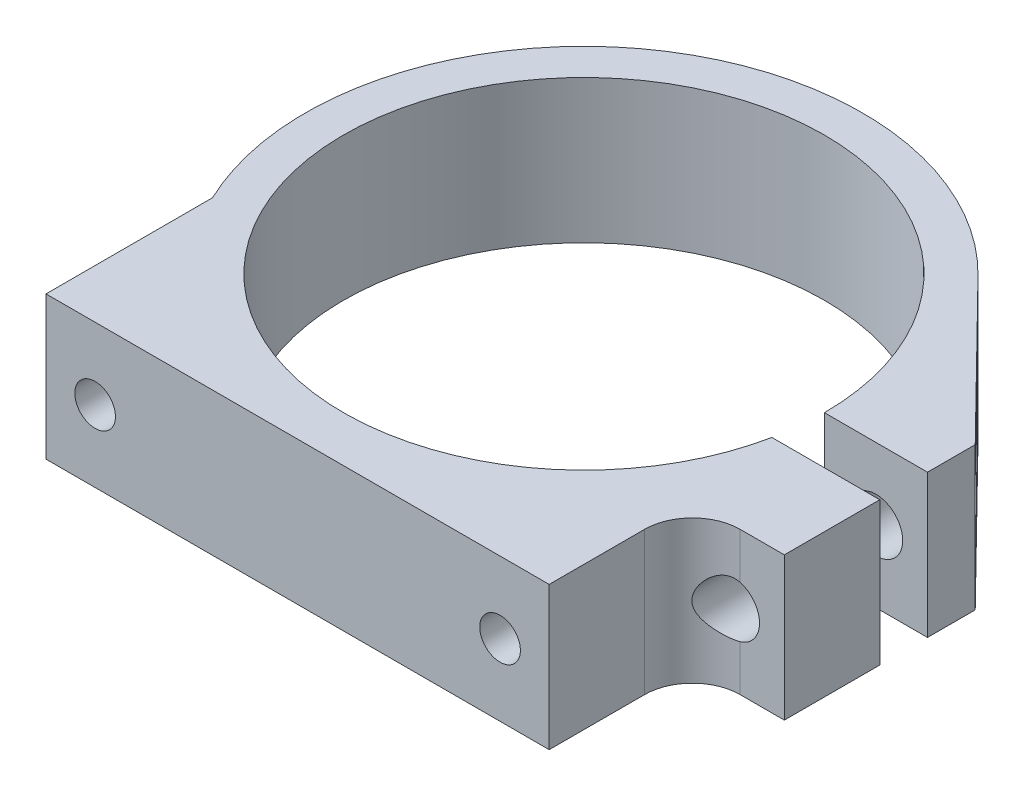
ISO-10303-21;
HEADER;
FILE_DESCRIPTION(('STEP AP214'),'2;1');
FILE_NAME('part.step','',(''),(''),'','','');
FILE_SCHEMA(('AUTOMOTIVE_DESIGN { 1 0 10303 214 1 1 1 1 }'));
ENDSEC;
DATA;
#1=APPLICATION_CONTEXT('core data for automotive mechanical design processes');
#2=APPLICATION_PROTOCOL_DEFINITION('international standard','automotive_design',2000,#1);
#3=PRODUCT_CONTEXT('',#1,'mechanical');
#4=PRODUCT('Part','Part','',(#3));
#5=PRODUCT_RELATED_PRODUCT_CATEGORY('part','',(#4));
#6=PRODUCT_DEFINITION_FORMATION('','',#4);
#7=PRODUCT_DEFINITION_CONTEXT('part definition',#1,'design');
#8=PRODUCT_DEFINITION('design','',#6,#7);
#9=PRODUCT_DEFINITION_SHAPE('','',#8);
#10=(LENGTH_UNIT() NAMED_UNIT(*) SI_UNIT(.MILLI.,.METRE.));
#11=(NAMED_UNIT(*) PLANE_ANGLE_UNIT() SI_UNIT($,.RADIAN.));
#12=(NAMED_UNIT(*) SI_UNIT($,.STERADIAN.) SOLID_ANGLE_UNIT());
#13=UNCERTAINTY_MEASURE_WITH_UNIT(LENGTH_MEASURE(1.E-05),#10,'distance_accuracy_value','');
#14=(GEOMETRIC_REPRESENTATION_CONTEXT(3) GLOBAL_UNCERTAINTY_ASSIGNED_CONTEXT((#13)) GLOBAL_UNIT_ASSIGNED_CONTEXT((#10,
#11,#12)) REPRESENTATION_CONTEXT('',''));
#15=CARTESIAN_POINT('',(0.,0.,0.));
#16=DIRECTION('',(0.,0.,1.));
#17=DIRECTION('',(1.,0.,0.));
#18=AXIS2_PLACEMENT_3D('',#15,#16,#17);
#19=CARTESIAN_POINT('',(22.858,8.58304100000002,-6.67001645187589));
#20=DIRECTION('',(1.,0.,0.));
#21=DIRECTION('',(0.,0.,-1.));
#22=AXIS2_PLACEMENT_3D('',#19,#20,#21);
#23=PLANE('',#22);
#24=DIRECTION('',(0.,-1.,0.));
#25=VECTOR('',#24,1.);
#26=CARTESIAN_POINT('',(22.858,9.52500000000001,0.));
#27=LINE('',#26,#25);
#28=CARTESIAN_POINT('',(22.858,9.52500000000001,0.));
#29=VERTEX_POINT('',#28);
#30=CARTESIAN_POINT('',(22.858,0.,0.));
#31=VERTEX_POINT('',#30);
#32=EDGE_CURVE('E207',#29,#31,#27,.T.);
#33=ORIENTED_EDGE('',*,*,#32,.T.);
#34=DIRECTION('',(0.,0.,1.));
#35=VECTOR('',#34,1.);
#36=CARTESIAN_POINT('',(22.858,0.,19.05));
#37=LINE('',#36,#35);
#38=CARTESIAN_POINT('',(22.858,0.,-3.175));
#39=VERTEX_POINT('',#38);
#40=EDGE_CURVE('E234',#39,#31,#37,.T.);
#41=ORIENTED_EDGE('',*,*,#40,.F.);
#42=DIRECTION('',(0.,1.,0.));
#43=VECTOR('',#42,1.);
#44=CARTESIAN_POINT('',(22.858,0.,-3.175));
#45=LINE('',#44,#43);
#46=CARTESIAN_POINT('',(22.858,1.883918,-3.175));
#47=VERTEX_POINT('',#46);
#48=EDGE_CURVE('E248',#39,#47,#45,.T.);
#49=ORIENTED_EDGE('',*,*,#48,.T.);
#50=DIRECTION('',(0.,-1.,0.));
#51=VECTOR('',#50,1.);
#52=CARTESIAN_POINT('',(22.858,7.641082,-3.175));
#53=LINE('',#52,#51);
#54=CARTESIAN_POINT('',(22.858,7.64108200000001,-3.175));
#55=VERTEX_POINT('',#54);
#56=EDGE_CURVE('E265',#55,#47,#53,.T.);
#57=ORIENTED_EDGE('',*,*,#56,.F.);
#58=DIRECTION('',(0.,1.,0.));
#59=VECTOR('',#58,1.);
#60=CARTESIAN_POINT('',(22.858,7.64108200000001,-3.175));
#61=LINE('',#60,#59);
#62=CARTESIAN_POINT('',(22.858,9.52500000000001,-3.175));
#63=VERTEX_POINT('',#62);
#64=EDGE_CURVE('E276',#55,#63,#61,.T.);
#65=ORIENTED_EDGE('',*,*,#64,.T.);
#66=DIRECTION('',(0.,0.,1.));
#67=VECTOR('',#66,1.);
#68=CARTESIAN_POINT('',(22.858,9.525,7.97180553457145));
#69=LINE('',#68,#67);
#70=EDGE_CURVE('E280',#63,#29,#69,.T.);
#71=ORIENTED_EDGE('',*,*,#70,.T.);
#72=EDGE_LOOP('',(#33,#41,#49,#57,#65,#71));
#73=FACE_BOUND('',#72,.T.);
#74=ADVANCED_FACE('F45',(#73),#23,.T.);
#75=DIRECTION('',(0.,-1.,0.));
#76=VECTOR('',#75,1.);
#77=CARTESIAN_POINT('',(22.858,9.52500000000001,3.175));
#78=LINE('',#77,#76);
#79=CARTESIAN_POINT('',(22.858,9.52500000000001,3.175));
#80=VERTEX_POINT('',#79);
#81=CARTESIAN_POINT('',(22.858,0.,3.175));
#82=VERTEX_POINT('',#81);
#83=EDGE_CURVE('E217',#80,#82,#78,.T.);
#84=ORIENTED_EDGE('',*,*,#83,.F.);
#85=CARTESIAN_POINT('',(22.858,9.52500000000001,9.525));
#86=VERTEX_POINT('',#85);
#87=EDGE_CURVE('E279',#80,#86,#69,.T.);
#88=ORIENTED_EDGE('',*,*,#87,.T.);
#89=DIRECTION('',(0.,-1.,0.));
#90=VECTOR('',#89,1.);
#91=CARTESIAN_POINT('',(22.858,9.52500000000001,9.525));
#92=LINE('',#91,#90);
#93=CARTESIAN_POINT('',(22.858,0.,9.525));
#94=VERTEX_POINT('',#93);
#95=EDGE_CURVE('E229',#86,#94,#92,.T.);
#96=ORIENTED_EDGE('',*,*,#95,.T.);
#97=EDGE_CURVE('E238',#82,#94,#37,.T.);
#98=ORIENTED_EDGE('',*,*,#97,.F.);
#99=EDGE_LOOP('',(#84,#88,#96,#98));
#100=FACE_BOUND('',#99,.T.);
#101=ADVANCED_FACE('F461',(#100),#23,.T.);
#102=CARTESIAN_POINT('',(13.2341292691636,-16.1619034699487,-12.9841532618839));
#103=DIRECTION('',(-0.713816187232019,0.,0.700333099921418));
#104=DIRECTION('',(0.700333099921418,0.,0.713816187232019));
#105=AXIS2_PLACEMENT_3D('',#102,#103,#104);
#106=PLANE('',#105);
#107=DIRECTION('',(0.,-1.,0.));
#108=VECTOR('',#107,1.);
#109=CARTESIAN_POINT('',(13.2341292691636,9.525,-12.9841532618839));
#110=LINE('',#109,#108);
#111=CARTESIAN_POINT('',(13.2341292691637,9.52500000000001,-12.9841532618839));
#112=VERTEX_POINT('',#111);
#113=CARTESIAN_POINT('',(13.2341292691636,0.,-12.9841532618839));
#114=VERTEX_POINT('',#113);
#115=EDGE_CURVE('E290',#112,#114,#110,.T.);
#116=ORIENTED_EDGE('',*,*,#115,.F.);
#117=DIRECTION('',(-0.700333099921418,0.,-0.713816187232019));
#118=VECTOR('',#117,1.);
#119=CARTESIAN_POINT('',(13.2341292691637,9.52500000000001,-12.9841532618839));
#120=LINE('',#119,#118);
#121=EDGE_CURVE('E283',#63,#112,#120,.T.);
#122=ORIENTED_EDGE('',*,*,#121,.F.);
#123=ORIENTED_EDGE('',*,*,#64,.F.);
#124=DIRECTION('',(0.700333099921418,0.,0.713816187232019));
#125=VECTOR('',#124,1.);
#126=CARTESIAN_POINT('',(19.429,7.64108200000001,-6.67001645187589));
#127=LINE('',#126,#125);
#128=CARTESIAN_POINT('',(19.429,7.641082,-6.67001645187589));
#129=VERTEX_POINT('',#128);
#130=EDGE_CURVE('E275',#129,#55,#127,.T.);
#131=ORIENTED_EDGE('',*,*,#130,.F.);
#132=CARTESIAN_POINT('',(19.429,4.7625,-6.67001645187589));
#133=DIRECTION('',(-0.713816187232019,0.,0.700333099921418));
#134=DIRECTION('',(0.700333099921418,0.,0.713816187232019));
#135=AXIS2_PLACEMENT_3D('',#132,#133,#134);
#136=ELLIPSE('',#135,4.11030408290426,2.878582);
#137=CARTESIAN_POINT('',(19.429,1.883918,-6.67001645187589));
#138=VERTEX_POINT('',#137);
#139=EDGE_CURVE('E289',#138,#129,#136,.F.);
#140=ORIENTED_EDGE('',*,*,#139,.F.);
#141=DIRECTION('',(0.700333099921418,0.,0.713816187232019));
#142=VECTOR('',#141,1.);
#143=CARTESIAN_POINT('',(22.858,1.883918,-3.175));
#144=LINE('',#143,#142);
#145=EDGE_CURVE('E232',#138,#47,#144,.T.);
#146=ORIENTED_EDGE('',*,*,#145,.T.);
#147=ORIENTED_EDGE('',*,*,#48,.F.);
#148=DIRECTION('',(0.700333099921418,0.,0.713816187232019));
#149=VECTOR('',#148,1.);
#150=CARTESIAN_POINT('',(22.858,0.,-3.175));
#151=LINE('',#150,#149);
#152=EDGE_CURVE('E246',#114,#39,#151,.T.);
#153=ORIENTED_EDGE('',*,*,#152,.F.);
#154=EDGE_LOOP('',(#116,#122,#123,#131,#140,#146,#147,#153));
#155=FACE_BOUND('',#154,.T.);
#156=ADVANCED_FACE('F451',(#155),#106,.F.);
#157=CARTESIAN_POINT('',(0.,9.525,0.));
#158=DIRECTION('',(0.,-1.,0.));
#159=DIRECTION('',(0.,0.,-1.));
#160=AXIS2_PLACEMENT_3D('',#157,#158,#159);
#161=CYLINDRICAL_SURFACE('',#160,18.539968);
#162=DIRECTION('',(0.,1.,0.));
#163=VECTOR('',#162,1.);
#164=CARTESIAN_POINT('',(-16.7386,9.525,7.97180553457144));
#165=LINE('',#164,#163);
#166=CARTESIAN_POINT('',(-16.7386,9.525,7.97180553457145));
#167=VERTEX_POINT('',#166);
#168=CARTESIAN_POINT('',(-16.7386,0.,7.97180553457145));
#169=VERTEX_POINT('',#168);
#170=EDGE_CURVE('E294',#167,#169,#165,.F.);
#171=ORIENTED_EDGE('',*,*,#170,.F.);
#172=CARTESIAN_POINT('',(0.,9.52500000000001,0.));
#173=DIRECTION('',(0.,1.,0.));
#174=DIRECTION('',(0.,0.,-1.));
#175=AXIS2_PLACEMENT_3D('',#172,#173,#174);
#176=CIRCLE('',#175,18.539968);
#177=EDGE_CURVE('E286',#112,#167,#176,.T.);
#178=ORIENTED_EDGE('',*,*,#177,.F.);
#179=ORIENTED_EDGE('',*,*,#115,.T.);
#180=CARTESIAN_POINT('',(0.,0.,0.));
#181=DIRECTION('',(0.,-1.,0.));
#182=DIRECTION('',(0.,0.,1.));
#183=AXIS2_PLACEMENT_3D('',#180,#181,#182);
#184=CIRCLE('',#183,18.539968);
#185=EDGE_CURVE('E243',#169,#114,#184,.T.);
#186=ORIENTED_EDGE('',*,*,#185,.F.);
#187=EDGE_LOOP('',(#171,#178,#179,#186));
#188=FACE_BOUND('',#187,.T.);
#189=ADVANCED_FACE('F460',(#188),#161,.T.);
#190=CARTESIAN_POINT('',(19.429,4.7625,-18.539968));
#191=DIRECTION('',(0.,0.,1.));
#192=DIRECTION('',(1.,0.,0.));
#193=AXIS2_PLACEMENT_3D('',#190,#191,#192);
#194=CYLINDRICAL_SURFACE('',#193,2.878582);
#195=ORIENTED_EDGE('',*,*,#139,.T.);
#196=DIRECTION('',(0.,0.,-1.));
#197=VECTOR('',#196,1.);
#198=CARTESIAN_POINT('',(19.429,7.641082,-3.175));
#199=LINE('',#198,#197);
#200=CARTESIAN_POINT('',(19.429,7.641082,-3.175));
#201=VERTEX_POINT('',#200);
#202=EDGE_CURVE('E271',#201,#129,#199,.T.);
#203=ORIENTED_EDGE('',*,*,#202,.F.);
#204=CARTESIAN_POINT('',(19.429,4.7625,-3.175));
#205=DIRECTION('',(0.,0.,-1.));
#206=DIRECTION('',(-1.,0.,0.));
#207=AXIS2_PLACEMENT_3D('',#204,#205,#206);
#208=CIRCLE('',#207,2.878582);
#209=CARTESIAN_POINT('',(19.429,1.883918,-3.175));
#210=VERTEX_POINT('',#209);
#211=EDGE_CURVE('E260',#210,#201,#208,.T.);
#212=ORIENTED_EDGE('',*,*,#211,.F.);
#213=DIRECTION('',(0.,0.,-1.));
#214=VECTOR('',#213,1.);
#215=CARTESIAN_POINT('',(19.429,1.883918,-3.175));
#216=LINE('',#215,#214);
#217=EDGE_CURVE('E272',#210,#138,#216,.T.);
#218=ORIENTED_EDGE('',*,*,#217,.T.);
#219=EDGE_LOOP('',(#195,#203,#212,#218));
#220=FACE_BOUND('',#219,.T.);
#221=ADVANCED_FACE('F464',(#220),#194,.F.);
#222=CARTESIAN_POINT('',(0.,9.52500000000001,0.));
#223=DIRECTION('',(0.,-1.,0.));
#224=DIRECTION('',(0.,0.,-1.));
#225=AXIS2_PLACEMENT_3D('',#222,#223,#224);
#226=PLANE('',#225);
#227=DIRECTION('',(-1.,0.,0.));
#228=VECTOR('',#227,1.);
#229=CARTESIAN_POINT('',(22.858,9.52500000000001,3.175));
#230=LINE('',#229,#228);
#231=CARTESIAN_POINT('',(15.6818166996047,9.52500000000001,3.175));
#232=VERTEX_POINT('',#231);
#233=EDGE_CURVE('E203',#80,#232,#230,.T.);
#234=ORIENTED_EDGE('',*,*,#233,.T.);
#235=CARTESIAN_POINT('',(0.,9.525,0.));
#236=DIRECTION('',(0.,1.,0.));
#237=DIRECTION('',(0.,0.,1.));
#238=AXIS2_PLACEMENT_3D('',#235,#236,#237);
#239=CIRCLE('',#238,16.);
#240=CARTESIAN_POINT('',(16.,9.525,0.));
#241=VERTEX_POINT('',#240);
#242=EDGE_CURVE('E194',#241,#232,#239,.T.);
#243=ORIENTED_EDGE('',*,*,#242,.F.);
#244=DIRECTION('',(1.,0.,0.));
#245=VECTOR('',#244,1.);
#246=CARTESIAN_POINT('',(16.,9.52500000000001,0.));
#247=LINE('',#246,#245);
#248=EDGE_CURVE('E200',#241,#29,#247,.T.);
#249=ORIENTED_EDGE('',*,*,#248,.T.);
#250=ORIENTED_EDGE('',*,*,#70,.F.);
#251=ORIENTED_EDGE('',*,*,#121,.T.);
#252=ORIENTED_EDGE('',*,*,#177,.T.);
#253=DIRECTION('',(0.,0.,-1.));
#254=VECTOR('',#253,1.);
#255=CARTESIAN_POINT('',(-16.7386,9.525,19.05));
#256=LINE('',#255,#254);
#257=CARTESIAN_POINT('',(-16.7386,9.525,19.05));
#258=VERTEX_POINT('',#257);
#259=EDGE_CURVE('E258',#258,#167,#256,.T.);
#260=ORIENTED_EDGE('',*,*,#259,.F.);
#261=DIRECTION('',(-1.,0.,0.));
#262=VECTOR('',#261,1.);
#263=CARTESIAN_POINT('',(-16.7386,9.525,19.05));
#264=LINE('',#263,#262);
#265=CARTESIAN_POINT('',(16.7386,9.52500000000001,19.05));
#266=VERTEX_POINT('',#265);
#267=EDGE_CURVE('E253',#266,#258,#264,.T.);
#268=ORIENTED_EDGE('',*,*,#267,.F.);
#269=DIRECTION('',(0.,0.,-1.));
#270=VECTOR('',#269,1.);
#271=CARTESIAN_POINT('',(16.7386,9.52500000000001,19.05));
#272=LINE('',#271,#270);
#273=CARTESIAN_POINT('',(16.7386,9.52500000000001,12.7));
#274=VERTEX_POINT('',#273);
#275=EDGE_CURVE('E221',#266,#274,#272,.T.);
#276=ORIENTED_EDGE('',*,*,#275,.T.);
#277=CARTESIAN_POINT('',(19.9136,9.52500000000001,12.7));
#278=DIRECTION('',(0.,-1.,0.));
#279=DIRECTION('',(0.,0.,-1.));
#280=AXIS2_PLACEMENT_3D('',#277,#278,#279);
#281=CIRCLE('',#280,3.175);
#282=CARTESIAN_POINT('',(19.9136,9.52500000000001,9.525));
#283=VERTEX_POINT('',#282);
#284=EDGE_CURVE('E13',#274,#283,#281,.T.);
#285=ORIENTED_EDGE('',*,*,#284,.T.);
#286=DIRECTION('',(1.,0.,0.));
#287=VECTOR('',#286,1.);
#288=CARTESIAN_POINT('',(16.7386,9.52500000000001,9.52499999999999));
#289=LINE('',#288,#287);
#290=EDGE_CURVE('E223',#283,#86,#289,.T.);
#291=ORIENTED_EDGE('',*,*,#290,.T.);
#292=ORIENTED_EDGE('',*,*,#87,.F.);
#293=EDGE_LOOP('',(#234,#243,#249,#250,#251,#252,#260,#268,#276,#285,#291,#292));
#294=FACE_BOUND('',#293,.T.);
#295=ADVANCED_FACE('F466',(#294),#226,.F.);
#296=CARTESIAN_POINT('',(19.429,7.641082,-3.175));
#297=DIRECTION('',(0.,1.,0.));
#298=DIRECTION('',(-1.,0.,0.));
#299=AXIS2_PLACEMENT_3D('',#296,#297,#298);
#300=PLANE('',#299);
#301=DIRECTION('',(1.,0.,0.));
#302=VECTOR('',#301,1.);
#303=CARTESIAN_POINT('',(19.429,7.641082,-3.175));
#304=LINE('',#303,#302);
#305=EDGE_CURVE('E263',#201,#55,#304,.T.);
#306=ORIENTED_EDGE('',*,*,#305,.F.);
#307=ORIENTED_EDGE('',*,*,#202,.T.);
#308=ORIENTED_EDGE('',*,*,#130,.T.);
#309=EDGE_LOOP('',(#306,#307,#308));
#310=FACE_BOUND('',#309,.T.);
#311=ADVANCED_FACE('F472',(#310),#300,.F.);
#312=CARTESIAN_POINT('',(19.429,4.7625,-3.175));
#313=DIRECTION('',(0.,0.,-1.));
#314=DIRECTION('',(-1.,0.,0.));
#315=AXIS2_PLACEMENT_3D('',#312,#313,#314);
#316=PLANE('',#315);
#317=CARTESIAN_POINT('',(19.429,4.7625,-3.175));
#318=DIRECTION('',(0.,0.,-1.));
#319=DIRECTION('',(-1.,0.,0.));
#320=AXIS2_PLACEMENT_3D('',#317,#318,#319);
#321=CIRCLE('',#320,1.77799999999998);
#322=CARTESIAN_POINT('',(17.651,4.7625,-3.175));
#323=VERTEX_POINT('',#322);
#324=EDGE_CURVE('E184',#323,#323,#321,.T.);
#325=ORIENTED_EDGE('',*,*,#324,.F.);
#326=EDGE_LOOP('',(#325));
#327=FACE_BOUND('',#326,.T.);
#328=ORIENTED_EDGE('',*,*,#211,.T.);
#329=ORIENTED_EDGE('',*,*,#305,.T.);
#330=ORIENTED_EDGE('',*,*,#56,.T.);
#331=DIRECTION('',(-1.,0.,0.));
#332=VECTOR('',#331,1.);
#333=CARTESIAN_POINT('',(22.858,1.883918,-3.175));
#334=LINE('',#333,#332);
#335=EDGE_CURVE('E268',#47,#210,#334,.T.);
#336=ORIENTED_EDGE('',*,*,#335,.T.);
#337=EDGE_LOOP('',(#328,#329,#330,#336));
#338=FACE_BOUND('',#337,.T.);
#339=ADVANCED_FACE('F486',(#327,#338),#316,.T.);
#340=CARTESIAN_POINT('',(-16.7386,1.88391799999999,19.05));
#341=DIRECTION('',(1.,0.,0.));
#342=DIRECTION('',(0.,0.,-1.));
#343=AXIS2_PLACEMENT_3D('',#340,#341,#342);
#344=PLANE('',#343);
#345=ORIENTED_EDGE('',*,*,#170,.T.);
#346=DIRECTION('',(0.,0.,-1.));
#347=VECTOR('',#346,1.);
#348=CARTESIAN_POINT('',(-16.7386,0.,7.97180553457145));
#349=LINE('',#348,#347);
#350=CARTESIAN_POINT('',(-16.7386,0.,19.05));
#351=VERTEX_POINT('',#350);
#352=EDGE_CURVE('E240',#351,#169,#349,.T.);
#353=ORIENTED_EDGE('',*,*,#352,.F.);
#354=DIRECTION('',(0.,-1.,0.));
#355=VECTOR('',#354,1.);
#356=CARTESIAN_POINT('',(-16.7386,1.88391799999999,19.05));
#357=LINE('',#356,#355);
#358=EDGE_CURVE('E255',#258,#351,#357,.T.);
#359=ORIENTED_EDGE('',*,*,#358,.F.);
#360=ORIENTED_EDGE('',*,*,#259,.T.);
#361=EDGE_LOOP('',(#345,#353,#359,#360));
#362=FACE_BOUND('',#361,.T.);
#363=ADVANCED_FACE('F490',(#362),#344,.F.);
#364=CARTESIAN_POINT('',(0.,0.,19.05));
#365=DIRECTION('',(0.,0.,-1.));
#366=DIRECTION('',(-1.,0.,0.));
#367=AXIS2_PLACEMENT_3D('',#364,#365,#366);
#368=PLANE('',#367);
#369=CARTESIAN_POINT('',(-13.4703841816037,4.7625,19.05));
#370=DIRECTION('',(0.,0.,1.));
#371=DIRECTION('',(1.,0.,0.));
#372=AXIS2_PLACEMENT_3D('',#369,#370,#371);
#373=CIRCLE('',#372,1.35254999999998);
#374=CARTESIAN_POINT('',(-12.1178341816037,4.7625,19.05));
#375=VERTEX_POINT('',#374);
#376=EDGE_CURVE('E174',#375,#375,#373,.T.);
#377=ORIENTED_EDGE('',*,*,#376,.F.);
#378=EDGE_LOOP('',(#377));
#379=FACE_BOUND('',#378,.T.);
#380=CARTESIAN_POINT('',(13.4703841816037,4.76250000000001,19.05));
#381=DIRECTION('',(0.,0.,1.));
#382=DIRECTION('',(1.,0.,0.));
#383=AXIS2_PLACEMENT_3D('',#380,#381,#382);
#384=CIRCLE('',#383,1.35254999999998);
#385=CARTESIAN_POINT('',(14.8229341816037,4.76250000000001,19.05));
#386=VERTEX_POINT('',#385);
#387=EDGE_CURVE('E173',#386,#386,#384,.T.);
#388=ORIENTED_EDGE('',*,*,#387,.F.);
#389=EDGE_LOOP('',(#388));
#390=FACE_BOUND('',#389,.T.);
#391=DIRECTION('',(-1.,0.,0.));
#392=VECTOR('',#391,1.);
#393=CARTESIAN_POINT('',(-16.7386,0.,19.05));
#394=LINE('',#393,#392);
#395=CARTESIAN_POINT('',(16.7386,0.,19.05));
#396=VERTEX_POINT('',#395);
#397=EDGE_CURVE('E237',#396,#351,#394,.T.);
#398=ORIENTED_EDGE('',*,*,#397,.F.);
#399=DIRECTION('',(0.,-1.,0.));
#400=VECTOR('',#399,1.);
#401=CARTESIAN_POINT('',(16.7386,9.52500000000001,19.05));
#402=LINE('',#401,#400);
#403=EDGE_CURVE('E226',#266,#396,#402,.T.);
#404=ORIENTED_EDGE('',*,*,#403,.F.);
#405=ORIENTED_EDGE('',*,*,#267,.T.);
#406=ORIENTED_EDGE('',*,*,#358,.T.);
#407=EDGE_LOOP('',(#398,#404,#405,#406));
#408=FACE_BOUND('',#407,.T.);
#409=ADVANCED_FACE('F494',(#379,#390,#408),#368,.F.);
#410=CARTESIAN_POINT('',(0.,1.883918,0.));
#411=DIRECTION('',(0.,1.,0.));
#412=DIRECTION('',(0.,0.,1.));
#413=AXIS2_PLACEMENT_3D('',#410,#411,#412);
#414=PLANE('',#413);
#415=ORIENTED_EDGE('',*,*,#217,.F.);
#416=ORIENTED_EDGE('',*,*,#335,.F.);
#417=ORIENTED_EDGE('',*,*,#145,.F.);
#418=EDGE_LOOP('',(#415,#416,#417));
#419=FACE_BOUND('',#418,.T.);
#420=ADVANCED_FACE('F498',(#419),#414,.T.);
#421=CARTESIAN_POINT('',(0.,0.,0.));
#422=DIRECTION('',(0.,1.,0.));
#423=DIRECTION('',(0.,0.,1.));
#424=AXIS2_PLACEMENT_3D('',#421,#422,#423);
#425=PLANE('',#424);
#426=DIRECTION('',(1.,0.,0.));
#427=VECTOR('',#426,1.);
#428=CARTESIAN_POINT('',(16.,0.,0.));
#429=LINE('',#428,#427);
#430=CARTESIAN_POINT('',(16.,0.,0.));
#431=VERTEX_POINT('',#430);
#432=EDGE_CURVE('E199',#431,#31,#429,.T.);
#433=ORIENTED_EDGE('',*,*,#432,.F.);
#434=CARTESIAN_POINT('',(0.,0.,0.));
#435=DIRECTION('',(0.,1.,0.));
#436=DIRECTION('',(0.,0.,1.));
#437=AXIS2_PLACEMENT_3D('',#434,#435,#436);
#438=CIRCLE('',#437,16.);
#439=CARTESIAN_POINT('',(15.6818166996047,0.,3.175));
#440=VERTEX_POINT('',#439);
#441=EDGE_CURVE('E196',#431,#440,#438,.T.);
#442=ORIENTED_EDGE('',*,*,#441,.T.);
#443=DIRECTION('',(-1.,0.,0.));
#444=VECTOR('',#443,1.);
#445=CARTESIAN_POINT('',(22.858,0.,3.175));
#446=LINE('',#445,#444);
#447=EDGE_CURVE('E204',#82,#440,#446,.T.);
#448=ORIENTED_EDGE('',*,*,#447,.F.);
#449=ORIENTED_EDGE('',*,*,#97,.T.);
#450=DIRECTION('',(1.,0.,0.));
#451=VECTOR('',#450,1.);
#452=CARTESIAN_POINT('',(16.7386,0.,9.52499999999999));
#453=LINE('',#452,#451);
#454=CARTESIAN_POINT('',(19.9136,0.,9.525));
#455=VERTEX_POINT('',#454);
#456=EDGE_CURVE('E224',#455,#94,#453,.T.);
#457=ORIENTED_EDGE('',*,*,#456,.F.);
#458=CARTESIAN_POINT('',(19.9136,0.,12.7));
#459=DIRECTION('',(0.,1.,0.));
#460=DIRECTION('',(0.,0.,1.));
#461=AXIS2_PLACEMENT_3D('',#458,#459,#460);
#462=CIRCLE('',#461,3.175);
#463=CARTESIAN_POINT('',(16.7386,0.,12.7));
#464=VERTEX_POINT('',#463);
#465=EDGE_CURVE('E54',#455,#464,#462,.T.);
#466=ORIENTED_EDGE('',*,*,#465,.T.);
#467=DIRECTION('',(0.,0.,-1.));
#468=VECTOR('',#467,1.);
#469=CARTESIAN_POINT('',(16.7386,0.,19.05));
#470=LINE('',#469,#468);
#471=EDGE_CURVE('E214',#396,#464,#470,.T.);
#472=ORIENTED_EDGE('',*,*,#471,.F.);
#473=ORIENTED_EDGE('',*,*,#397,.T.);
#474=ORIENTED_EDGE('',*,*,#352,.T.);
#475=ORIENTED_EDGE('',*,*,#185,.T.);
#476=ORIENTED_EDGE('',*,*,#152,.T.);
#477=ORIENTED_EDGE('',*,*,#40,.T.);
#478=EDGE_LOOP('',(#433,#442,#448,#449,#457,#466,#472,#473,#474,#475,#476,#477));
#479=FACE_BOUND('',#478,.T.);
#480=ADVANCED_FACE('F502',(#479),#425,.F.);
#481=CARTESIAN_POINT('',(16.7386,9.52500000000001,9.52499999999999));
#482=DIRECTION('',(0.,0.,-1.));
#483=DIRECTION('',(-1.,0.,0.));
#484=AXIS2_PLACEMENT_3D('',#481,#482,#483);
#485=PLANE('',#484);
#486=ORIENTED_EDGE('',*,*,#290,.F.);
#487=DIRECTION('',(0.,-1.,0.));
#488=VECTOR('',#487,1.);
#489=CARTESIAN_POINT('',(19.9136,0.,9.525));
#490=LINE('',#489,#488);
#491=CARTESIAN_POINT('',(19.9136,6.47318607289588,9.525));
#492=VERTEX_POINT('',#491);
#493=EDGE_CURVE('E540',#283,#492,#490,.T.);
#494=ORIENTED_EDGE('',*,*,#493,.T.);
#495=CARTESIAN_POINT('',(19.429,4.7625,9.525));
#496=DIRECTION('',(0.,0.,-1.));
#497=DIRECTION('',(-1.,0.,0.));
#498=AXIS2_PLACEMENT_3D('',#495,#496,#497);
#499=CIRCLE('',#498,1.77799999999998);
#500=CARTESIAN_POINT('',(19.9136,3.05181392710412,9.525));
#501=VERTEX_POINT('',#500);
#502=EDGE_CURVE('E188',#492,#501,#499,.T.);
#503=ORIENTED_EDGE('',*,*,#502,.T.);
#504=DIRECTION('',(0.,-1.,0.));
#505=VECTOR('',#504,1.);
#506=CARTESIAN_POINT('',(19.9136,0.,9.525));
#507=LINE('',#506,#505);
#508=EDGE_CURVE('E543',#501,#455,#507,.T.);
#509=ORIENTED_EDGE('',*,*,#508,.T.);
#510=ORIENTED_EDGE('',*,*,#456,.T.);
#511=ORIENTED_EDGE('',*,*,#95,.F.);
#512=EDGE_LOOP('',(#486,#494,#503,#509,#510,#511));
#513=FACE_BOUND('',#512,.T.);
#514=ADVANCED_FACE('F506',(#513),#485,.F.);
#515=CARTESIAN_POINT('',(16.7386,9.52500000000001,19.05));
#516=DIRECTION('',(-1.,0.,0.));
#517=DIRECTION('',(0.,0.,1.));
#518=AXIS2_PLACEMENT_3D('',#515,#516,#517);
#519=PLANE('',#518);
#520=ORIENTED_EDGE('',*,*,#471,.T.);
#521=DIRECTION('',(0.,-1.,0.));
#522=VECTOR('',#521,1.);
#523=CARTESIAN_POINT('',(16.7386,9.52500000000001,12.7));
#524=LINE('',#523,#522);
#525=EDGE_CURVE('E61',#464,#274,#524,.F.);
#526=ORIENTED_EDGE('',*,*,#525,.T.);
#527=ORIENTED_EDGE('',*,*,#275,.F.);
#528=ORIENTED_EDGE('',*,*,#403,.T.);
#529=EDGE_LOOP('',(#520,#526,#527,#528));
#530=FACE_BOUND('',#529,.T.);
#531=ADVANCED_FACE('F507',(#530),#519,.F.);
#532=CARTESIAN_POINT('',(16.,9.52500000000001,0.));
#533=DIRECTION('',(0.,0.,-1.));
#534=DIRECTION('',(-1.,0.,0.));
#535=AXIS2_PLACEMENT_3D('',#532,#533,#534);
#536=PLANE('',#535);
#537=CARTESIAN_POINT('',(19.429,4.7625,0.));
#538=DIRECTION('',(0.,0.,-1.));
#539=DIRECTION('',(-1.,0.,0.));
#540=AXIS2_PLACEMENT_3D('',#537,#538,#539);
#541=CIRCLE('',#540,1.77799999999998);
#542=CARTESIAN_POINT('',(17.651,4.7625,0.));
#543=VERTEX_POINT('',#542);
#544=EDGE_CURVE('E191',#543,#543,#541,.T.);
#545=ORIENTED_EDGE('',*,*,#544,.T.);
#546=EDGE_LOOP('',(#545));
#547=FACE_BOUND('',#546,.T.);
#548=ORIENTED_EDGE('',*,*,#432,.T.);
#549=ORIENTED_EDGE('',*,*,#32,.F.);
#550=ORIENTED_EDGE('',*,*,#248,.F.);
#551=DIRECTION('',(0.,-1.,0.));
#552=VECTOR('',#551,1.);
#553=CARTESIAN_POINT('',(16.,9.52500000000001,0.));
#554=LINE('',#553,#552);
#555=EDGE_CURVE('E211',#241,#431,#554,.T.);
#556=ORIENTED_EDGE('',*,*,#555,.T.);
#557=EDGE_LOOP('',(#548,#549,#550,#556));
#558=FACE_BOUND('',#557,.T.);
#559=ADVANCED_FACE('F510',(#547,#558),#536,.F.);
#560=CARTESIAN_POINT('',(22.858,9.52500000000001,3.175));
#561=DIRECTION('',(0.,0.,1.));
#562=DIRECTION('',(1.,0.,0.));
#563=AXIS2_PLACEMENT_3D('',#560,#561,#562);
#564=PLANE('',#563);
#565=CARTESIAN_POINT('',(19.429,4.7625,3.175));
#566=DIRECTION('',(0.,0.,1.));
#567=DIRECTION('',(1.,0.,0.));
#568=AXIS2_PLACEMENT_3D('',#565,#566,#567);
#569=CIRCLE('',#568,1.77799999999998);
#570=CARTESIAN_POINT('',(21.207,4.7625,3.175));
#571=VERTEX_POINT('',#570);
#572=EDGE_CURVE('E187',#571,#571,#569,.T.);
#573=ORIENTED_EDGE('',*,*,#572,.T.);
#574=EDGE_LOOP('',(#573));
#575=FACE_BOUND('',#574,.T.);
#576=ORIENTED_EDGE('',*,*,#447,.T.);
#577=DIRECTION('',(0.,-1.,0.));
#578=VECTOR('',#577,1.);
#579=CARTESIAN_POINT('',(15.6818166996047,9.52500000000001,3.175));
#580=LINE('',#579,#578);
#581=EDGE_CURVE('E215',#232,#440,#580,.T.);
#582=ORIENTED_EDGE('',*,*,#581,.F.);
#583=ORIENTED_EDGE('',*,*,#233,.F.);
#584=ORIENTED_EDGE('',*,*,#83,.T.);
#585=EDGE_LOOP('',(#576,#582,#583,#584));
#586=FACE_BOUND('',#585,.T.);
#587=ADVANCED_FACE('F516',(#575,#586),#564,.F.);
#588=CARTESIAN_POINT('',(0.,0.,0.));
#589=DIRECTION('',(0.,1.,0.));
#590=DIRECTION('',(0.,0.,1.));
#591=AXIS2_PLACEMENT_3D('',#588,#589,#590);
#592=CYLINDRICAL_SURFACE('',#591,16.);
#593=ORIENTED_EDGE('',*,*,#242,.T.);
#594=ORIENTED_EDGE('',*,*,#581,.T.);
#595=ORIENTED_EDGE('',*,*,#441,.F.);
#596=ORIENTED_EDGE('',*,*,#555,.F.);
#597=EDGE_LOOP('',(#593,#594,#595,#596));
#598=FACE_BOUND('',#597,.T.);
#599=ADVANCED_FACE('F520',(#598),#592,.F.);
#600=CARTESIAN_POINT('',(19.429,4.7625,-3.175));
#601=DIRECTION('',(0.,0.,-1.));
#602=DIRECTION('',(-1.,0.,0.));
#603=AXIS2_PLACEMENT_3D('',#600,#601,#602);
#604=CYLINDRICAL_SURFACE('',#603,1.77799999999998);
#605=ORIENTED_EDGE('',*,*,#572,.F.);
#606=EDGE_LOOP('',(#605));
#607=FACE_BOUND('',#606,.T.);
#608=ORIENTED_EDGE('',*,*,#502,.F.);
#609=CARTESIAN_POINT('',(19.9136,6.47318607289588,9.525));
#610=CARTESIAN_POINT('',(19.8702476303357,6.48547465284143,9.52499223011757));
#611=CARTESIAN_POINT('',(19.8264241967609,6.496100873256,9.52588774354046));
#612=CARTESIAN_POINT('',(19.7381795905216,6.51398837810309,9.52954424646579));
#613=CARTESIAN_POINT('',(19.6937585085248,6.52125016715144,9.53230495606311));
#614=CARTESIAN_POINT('',(19.604838316781,6.53234877107768,9.53973496943846));
#615=CARTESIAN_POINT('',(19.5603403326164,6.53619994887202,9.54439614747338));
#616=CARTESIAN_POINT('',(19.4714334643573,6.54055154404005,9.55561995132717));
#617=CARTESIAN_POINT('',(19.4270245785982,6.54105202460572,9.5621825412842));
#618=CARTESIAN_POINT('',(19.2944276970978,6.53759694109973,9.58467479069915));
#619=CARTESIAN_POINT('',(19.206784456172,6.52869517065011,9.60341601379023));
#620=CARTESIAN_POINT('',(19.0354263516683,6.49858118944396,9.64757517985509));
#621=CARTESIAN_POINT('',(18.9517141181474,6.47736086025782,9.67299751990303));
#622=CARTESIAN_POINT('',(18.7864453252156,6.42271040422369,9.73046827892841));
#623=CARTESIAN_POINT('',(18.705130310205,6.38880112566594,9.76275177089649));
#624=CARTESIAN_POINT('',(18.5497718273847,6.31034651732962,9.83157998777192));
#625=CARTESIAN_POINT('',(18.4757328229619,6.26579471579156,9.86812729857849));
#626=CARTESIAN_POINT('',(18.3248102088075,6.15958188767529,9.94957947388442));
#627=CARTESIAN_POINT('',(18.2492651485293,6.09633917739783,9.99490161008587));
#628=CARTESIAN_POINT('',(18.109632548418,5.95840857693983,10.0859462808173));
#629=CARTESIAN_POINT('',(18.0455536566195,5.88371212628473,10.1316690905084));
#630=CARTESIAN_POINT('',(17.9345619930396,5.73006304979781,10.2163533525536));
#631=CARTESIAN_POINT('',(17.8866764599173,5.65195186923513,10.2555622195207));
#632=CARTESIAN_POINT('',(17.8026776547623,5.48699340681955,10.3277240216018));
#633=CARTESIAN_POINT('',(17.766543429143,5.40016203980873,10.3606880474811));
#634=CARTESIAN_POINT('',(17.7149031869279,5.24042923590011,10.4092997282));
#635=CARTESIAN_POINT('',(17.6965316553121,5.16915349109741,10.4272027764704));
#636=CARTESIAN_POINT('',(17.6686800852522,5.02335398087664,10.4547046230645));
#637=CARTESIAN_POINT('',(17.6591871467197,4.94883509294788,10.4643154679064));
#638=CARTESIAN_POINT('',(17.6497508088012,4.79818896088168,10.4738678429741));
#639=CARTESIAN_POINT('',(17.6498531754076,4.72205574052708,10.4737630332123));
#640=CARTESIAN_POINT('',(17.6597155196709,4.57105790103965,10.4637816577629));
#641=CARTESIAN_POINT('',(17.6694812459371,4.49619406401073,10.4538992755229));
#642=CARTESIAN_POINT('',(17.6971172654711,4.35407016870253,10.4266386793659));
#643=CARTESIAN_POINT('',(17.7144922974239,4.2866200885245,10.4097213063327));
#644=CARTESIAN_POINT('',(17.7563346810558,4.15570039620371,10.3702663442646));
#645=CARTESIAN_POINT('',(17.7808073379849,4.09223380491731,10.3477245529218));
#646=CARTESIAN_POINT('',(17.8515057463243,3.93560673979696,10.2851138251657));
#647=CARTESIAN_POINT('',(17.9022565792522,3.84558809434367,10.2422741499407));
#648=CARTESIAN_POINT('',(18.0172384053214,3.67683247414058,10.1524944267335));
#649=CARTESIAN_POINT('',(18.0814976458137,3.59811973100172,10.1055459087802));
#650=CARTESIAN_POINT('',(18.2236124328794,3.45142237067441,10.0107636303633));
#651=CARTESIAN_POINT('',(18.3016853028445,3.38364849440793,9.96292869419276));
#652=CARTESIAN_POINT('',(18.4696582515353,3.2619416805227,9.87072228327312));
#653=CARTESIAN_POINT('',(18.5595415204781,3.2079893866198,9.82634602616693));
#654=CARTESIAN_POINT('',(18.736852600196,3.12221286702548,9.74976179113));
#655=CARTESIAN_POINT('',(18.8229404299482,3.08837327077451,9.71671967159743));
#656=CARTESIAN_POINT('',(19.0015165374065,3.03413869745667,9.65737621745898));
#657=CARTESIAN_POINT('',(19.0940034801515,3.01374092549094,9.63107348225841));
#658=CARTESIAN_POINT('',(19.2835866337134,2.98785976643358,9.58660239854304));
#659=CARTESIAN_POINT('',(19.3807075745904,2.98246835562457,9.56848478208364));
#660=CARTESIAN_POINT('',(19.5757090683599,2.98789378385616,9.54150436749521));
#661=CARTESIAN_POINT('',(19.673587758532,2.99867886435117,9.53262349323235));
#662=CARTESIAN_POINT('',(19.7940975272972,3.02221207124041,9.5271556908252));
#663=CARTESIAN_POINT('',(19.8181832505724,3.02744050834174,9.52634271661989));
#664=CARTESIAN_POINT('',(19.8660884471912,3.03888762301631,9.52526602896084));
#665=CARTESIAN_POINT('',(19.8899082961639,3.0451046422489,9.5250014059018));
#666=CARTESIAN_POINT('',(19.9136,3.05181392710412,9.525));
#667=B_SPLINE_CURVE_WITH_KNOTS('',3,(#609,#610,#611,#612,#613,#614,#615,#616,#617,#618,#619,
#620,#621,#622,#623,#624,#625,#626,#627,#628,#629,#630,#631,#632,#633,#634,#635,#636,#637,#638,
#639,#640,#641,#642,#643,#644,#645,#646,#647,#648,#649,#650,#651,#652,#653,#654,#655,#656,#657,
#658,#659,#660,#661,#662,#663,#664,#665,#666),.UNSPECIFIED.,.F.,.F.,(4,2,2,2,2,2,2,2,2,2,2,2,2,
2,2,2,2,2,2,2,2,2,2,2,2,2,2,2,4),(0.,0.135138630658197,0.270256985917931,0.404803581233943,
0.539347639081357,0.808181297019418,1.07719232870217,1.35759923078286,1.63817708541983,
1.96225394191348,2.28657420335152,2.58449367113417,2.88187897272087,3.10824259083248,
3.33427680226878,3.56138916638162,3.78863671801252,4.00289240801658,4.21730866194954,
4.55110703866079,4.88561048885928,5.22594027105625,5.5657908040508,5.8592452217843,
6.15263860357469,6.44782631963325,6.74243526557671,6.81639955861756,6.89024106109764),.UNSPECIFIED.);
#668=EDGE_CURVE('E534',#492,#501,#667,.T.);
#669=ORIENTED_EDGE('',*,*,#668,.T.);
#670=EDGE_LOOP('',(#608,#669));
#671=FACE_BOUND('',#670,.T.);
#672=ADVANCED_FACE('F524',(#607,#671),#604,.F.);
#673=ORIENTED_EDGE('',*,*,#324,.T.);
#674=EDGE_LOOP('',(#673));
#675=FACE_BOUND('',#674,.T.);
#676=ORIENTED_EDGE('',*,*,#544,.F.);
#677=EDGE_LOOP('',(#676));
#678=FACE_BOUND('',#677,.T.);
#679=ADVANCED_FACE('F526',(#675,#678),#604,.F.);
#680=CARTESIAN_POINT('',(13.4703841816037,4.76250000000001,11.43));
#681=DIRECTION('',(0.,0.,1.));
#682=DIRECTION('',(1.,0.,0.));
#683=AXIS2_PLACEMENT_3D('',#680,#681,#682);
#684=CONICAL_SURFACE('',#683,1.35254999999998,1.02974425864683);
#685=CARTESIAN_POINT('',(13.4703841816037,4.76250000000001,10.6173059696794));
#686=VERTEX_POINT('',#685);
#687=VERTEX_LOOP('',#686);
#688=FACE_BOUND('',#687,.T.);
#689=CARTESIAN_POINT('',(13.4703841816037,4.76250000000001,11.43));
#690=DIRECTION('',(0.,0.,1.));
#691=DIRECTION('',(1.,0.,0.));
#692=AXIS2_PLACEMENT_3D('',#689,#690,#691);
#693=CIRCLE('',#692,1.35254999999998);
#694=CARTESIAN_POINT('',(14.8229341816037,4.76250000000001,11.43));
#695=VERTEX_POINT('',#694);
#696=EDGE_CURVE('E177',#695,#695,#693,.T.);
#697=ORIENTED_EDGE('',*,*,#696,.T.);
#698=EDGE_LOOP('',(#697));
#699=FACE_BOUND('',#698,.T.);
#700=ADVANCED_FACE('F530',(#688,#699),#684,.F.);
#701=CARTESIAN_POINT('',(13.4703841816037,4.76250000000001,19.05));
#702=DIRECTION('',(0.,0.,1.));
#703=DIRECTION('',(1.,0.,0.));
#704=AXIS2_PLACEMENT_3D('',#701,#702,#703);
#705=CYLINDRICAL_SURFACE('',#704,1.35254999999998);
#706=ORIENTED_EDGE('',*,*,#696,.F.);
#707=EDGE_LOOP('',(#706));
#708=FACE_BOUND('',#707,.T.);
#709=ORIENTED_EDGE('',*,*,#387,.T.);
#710=EDGE_LOOP('',(#709));
#711=FACE_BOUND('',#710,.T.);
#712=ADVANCED_FACE('F167',(#708,#711),#705,.F.);
#713=CARTESIAN_POINT('',(-13.4703841816037,4.7625,11.43));
#714=DIRECTION('',(0.,0.,1.));
#715=DIRECTION('',(1.,0.,0.));
#716=AXIS2_PLACEMENT_3D('',#713,#714,#715);
#717=CONICAL_SURFACE('',#716,1.35254999999998,1.02974425864683);
#718=CARTESIAN_POINT('',(-13.4703841816037,4.7625,10.6173059696794));
#719=VERTEX_POINT('',#718);
#720=VERTEX_LOOP('',#719);
#721=FACE_BOUND('',#720,.T.);
#722=CARTESIAN_POINT('',(-13.4703841816037,4.7625,11.43));
#723=DIRECTION('',(0.,0.,1.));
#724=DIRECTION('',(1.,0.,0.));
#725=AXIS2_PLACEMENT_3D('',#722,#723,#724);
#726=CIRCLE('',#725,1.35254999999998);
#727=CARTESIAN_POINT('',(-12.1178341816038,4.7625,11.43));
#728=VERTEX_POINT('',#727);
#729=EDGE_CURVE('E171',#728,#728,#726,.T.);
#730=ORIENTED_EDGE('',*,*,#729,.T.);
#731=EDGE_LOOP('',(#730));
#732=FACE_BOUND('',#731,.T.);
#733=ADVANCED_FACE('F163',(#721,#732),#717,.F.);
#734=CARTESIAN_POINT('',(-13.4703841816037,4.7625,19.05));
#735=DIRECTION('',(0.,0.,1.));
#736=DIRECTION('',(1.,0.,0.));
#737=AXIS2_PLACEMENT_3D('',#734,#735,#736);
#738=CYLINDRICAL_SURFACE('',#737,1.35254999999998);
#739=ORIENTED_EDGE('',*,*,#729,.F.);
#740=EDGE_LOOP('',(#739));
#741=FACE_BOUND('',#740,.T.);
#742=ORIENTED_EDGE('',*,*,#376,.T.);
#743=EDGE_LOOP('',(#742));
#744=FACE_BOUND('',#743,.T.);
#745=ADVANCED_FACE('F166',(#741,#744),#738,.F.);
#746=CARTESIAN_POINT('',(19.9136,9.52500000000001,12.7));
#747=DIRECTION('',(0.,1.,0.));
#748=DIRECTION('',(0.,0.,1.));
#749=AXIS2_PLACEMENT_3D('',#746,#747,#748);
#750=CYLINDRICAL_SURFACE('',#749,3.175);
#751=ORIENTED_EDGE('',*,*,#284,.F.);
#752=ORIENTED_EDGE('',*,*,#525,.F.);
#753=ORIENTED_EDGE('',*,*,#465,.F.);
#754=ORIENTED_EDGE('',*,*,#508,.F.);
#755=ORIENTED_EDGE('',*,*,#668,.F.);
#756=ORIENTED_EDGE('',*,*,#493,.F.);
#757=EDGE_LOOP('',(#751,#752,#753,#754,#755,#756));
#758=FACE_BOUND('',#757,.T.);
#759=ADVANCED_FACE('F47',(#758),#750,.F.);
#760=CLOSED_SHELL('',(#74,#101,#156,#189,#221,#295,#311,#339,#363,#409,#420,#480,#514,#531,#559,
#587,#599,#672,#679,#700,#712,#733,#745,#759));
#761=MANIFOLD_SOLID_BREP('B2',#760);
#762=ADVANCED_BREP_SHAPE_REPRESENTATION('',(#18,#761),#14);
#763=SHAPE_DEFINITION_REPRESENTATION(#9,#762);
ENDSEC;
END-ISO-10303-21;
